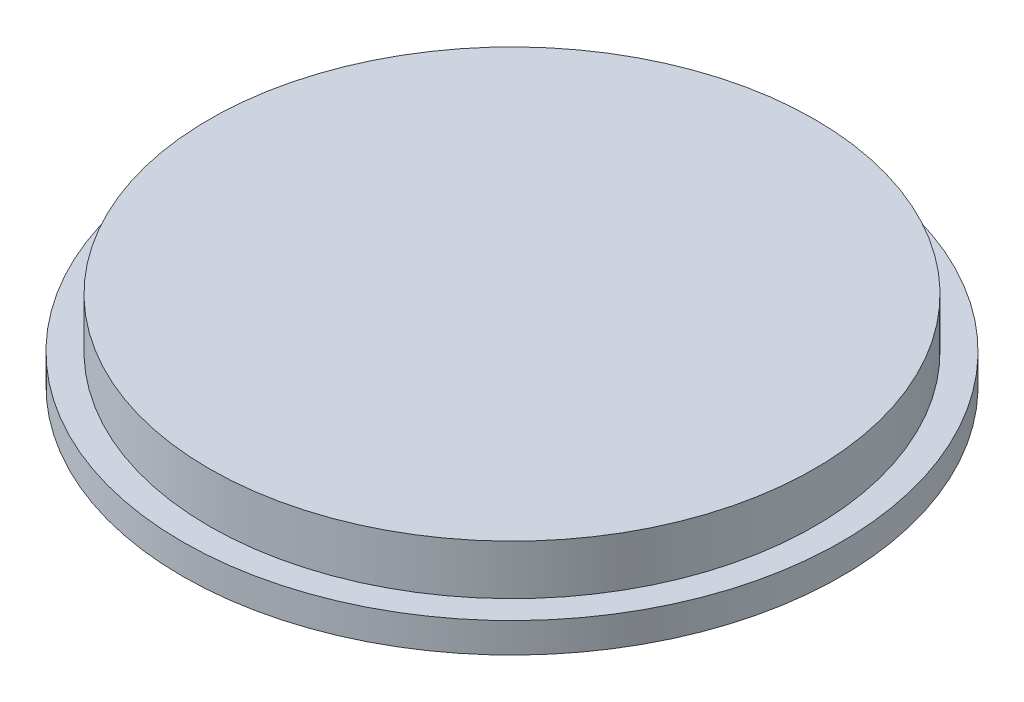
ISO-10303-21;
HEADER;
FILE_DESCRIPTION(('STEP AP214'),'2;1');
FILE_NAME('part.step','',(''),(''),'','','');
FILE_SCHEMA(('AUTOMOTIVE_DESIGN { 1 0 10303 214 1 1 1 1 }'));
ENDSEC;
DATA;
#1=APPLICATION_CONTEXT('core data for automotive mechanical design processes');
#2=APPLICATION_PROTOCOL_DEFINITION('international standard','automotive_design',2000,#1);
#3=PRODUCT_CONTEXT('',#1,'mechanical');
#4=PRODUCT('Part','Part','',(#3));
#5=PRODUCT_RELATED_PRODUCT_CATEGORY('part','',(#4));
#6=PRODUCT_DEFINITION_FORMATION('','',#4);
#7=PRODUCT_DEFINITION_CONTEXT('part definition',#1,'design');
#8=PRODUCT_DEFINITION('design','',#6,#7);
#9=PRODUCT_DEFINITION_SHAPE('','',#8);
#10=(LENGTH_UNIT() NAMED_UNIT(*) SI_UNIT(.MILLI.,.METRE.));
#11=(NAMED_UNIT(*) PLANE_ANGLE_UNIT() SI_UNIT($,.RADIAN.));
#12=(NAMED_UNIT(*) SI_UNIT($,.STERADIAN.) SOLID_ANGLE_UNIT());
#13=UNCERTAINTY_MEASURE_WITH_UNIT(LENGTH_MEASURE(1.E-05),#10,'distance_accuracy_value','');
#14=(GEOMETRIC_REPRESENTATION_CONTEXT(3) GLOBAL_UNCERTAINTY_ASSIGNED_CONTEXT((#13)) GLOBAL_UNIT_ASSIGNED_CONTEXT((#10,
#11,#12)) REPRESENTATION_CONTEXT('',''));
#15=CARTESIAN_POINT('',(0.,0.,0.));
#16=DIRECTION('',(0.,0.,1.));
#17=DIRECTION('',(1.,0.,0.));
#18=AXIS2_PLACEMENT_3D('',#15,#16,#17);
#19=CARTESIAN_POINT('',(0.,3.,0.));
#20=DIRECTION('',(0.,-1.,0.));
#21=DIRECTION('',(0.,0.,-1.));
#22=AXIS2_PLACEMENT_3D('',#19,#20,#21);
#23=CYLINDRICAL_SURFACE('',#22,33.1);
#24=CARTESIAN_POINT('',(0.,3.,0.));
#25=DIRECTION('',(0.,1.,0.));
#26=DIRECTION('',(0.,0.,1.));
#27=AXIS2_PLACEMENT_3D('',#24,#25,#26);
#28=CIRCLE('',#27,33.1);
#29=CARTESIAN_POINT('',(0.,3.,33.1));
#30=VERTEX_POINT('',#29);
#31=EDGE_CURVE('E45',#30,#30,#28,.T.);
#32=ORIENTED_EDGE('',*,*,#31,.F.);
#33=EDGE_LOOP('',(#32));
#34=FACE_BOUND('',#33,.T.);
#35=CARTESIAN_POINT('',(0.,0.,0.));
#36=DIRECTION('',(0.,1.,0.));
#37=DIRECTION('',(0.,0.,1.));
#38=AXIS2_PLACEMENT_3D('',#35,#36,#37);
#39=CIRCLE('',#38,33.1);
#40=CARTESIAN_POINT('',(0.,0.,33.1));
#41=VERTEX_POINT('',#40);
#42=EDGE_CURVE('E40',#41,#41,#39,.T.);
#43=ORIENTED_EDGE('',*,*,#42,.T.);
#44=EDGE_LOOP('',(#43));
#45=FACE_BOUND('',#44,.T.);
#46=ADVANCED_FACE('F37',(#34,#45),#23,.T.);
#47=CARTESIAN_POINT('',(0.,3.,0.));
#48=DIRECTION('',(0.,1.,0.));
#49=DIRECTION('',(0.,0.,1.));
#50=AXIS2_PLACEMENT_3D('',#47,#48,#49);
#51=PLANE('',#50);
#52=CARTESIAN_POINT('',(0.,3.,0.));
#53=DIRECTION('',(0.,1.,0.));
#54=DIRECTION('',(0.,0.,1.));
#55=AXIS2_PLACEMENT_3D('',#52,#53,#54);
#56=CIRCLE('',#55,30.4);
#57=CARTESIAN_POINT('',(0.,3.,30.4));
#58=VERTEX_POINT('',#57);
#59=EDGE_CURVE('E10',#58,#58,#56,.T.);
#60=ORIENTED_EDGE('',*,*,#59,.F.);
#61=EDGE_LOOP('',(#60));
#62=FACE_BOUND('',#61,.T.);
#63=ORIENTED_EDGE('',*,*,#31,.T.);
#64=EDGE_LOOP('',(#63));
#65=FACE_BOUND('',#64,.T.);
#66=ADVANCED_FACE('F65',(#62,#65),#51,.T.);
#67=CARTESIAN_POINT('',(0.,0.,0.));
#68=DIRECTION('',(0.,1.,0.));
#69=DIRECTION('',(0.,0.,1.));
#70=AXIS2_PLACEMENT_3D('',#67,#68,#69);
#71=PLANE('',#70);
#72=ORIENTED_EDGE('',*,*,#42,.F.);
#73=EDGE_LOOP('',(#72));
#74=FACE_BOUND('',#73,.T.);
#75=ADVANCED_FACE('F62',(#74),#71,.F.);
#76=CARTESIAN_POINT('',(0.,8.,0.));
#77=DIRECTION('',(0.,-1.,0.));
#78=DIRECTION('',(0.,0.,-1.));
#79=AXIS2_PLACEMENT_3D('',#76,#77,#78);
#80=CYLINDRICAL_SURFACE('',#79,30.4);
#81=CARTESIAN_POINT('',(0.,8.,0.));
#82=DIRECTION('',(0.,1.,0.));
#83=DIRECTION('',(0.,0.,1.));
#84=AXIS2_PLACEMENT_3D('',#81,#82,#83);
#85=CIRCLE('',#84,30.4);
#86=CARTESIAN_POINT('',(0.,8.,30.4));
#87=VERTEX_POINT('',#86);
#88=EDGE_CURVE('E52',#87,#87,#85,.T.);
#89=ORIENTED_EDGE('',*,*,#88,.F.);
#90=EDGE_LOOP('',(#89));
#91=FACE_BOUND('',#90,.T.);
#92=ORIENTED_EDGE('',*,*,#59,.T.);
#93=EDGE_LOOP('',(#92));
#94=FACE_BOUND('',#93,.T.);
#95=ADVANCED_FACE('F64',(#91,#94),#80,.T.);
#96=CARTESIAN_POINT('',(0.,8.,0.));
#97=DIRECTION('',(0.,1.,0.));
#98=DIRECTION('',(0.,0.,1.));
#99=AXIS2_PLACEMENT_3D('',#96,#97,#98);
#100=PLANE('',#99);
#101=ORIENTED_EDGE('',*,*,#88,.T.);
#102=EDGE_LOOP('',(#101));
#103=FACE_BOUND('',#102,.T.);
#104=ADVANCED_FACE('F70',(#103),#100,.T.);
#105=CLOSED_SHELL('',(#46,#66,#75,#95,#104));
#106=MANIFOLD_SOLID_BREP('B2',#105);
#107=ADVANCED_BREP_SHAPE_REPRESENTATION('',(#18,#106),#14);
#108=SHAPE_DEFINITION_REPRESENTATION(#9,#107);
ENDSEC;
END-ISO-10303-21;
